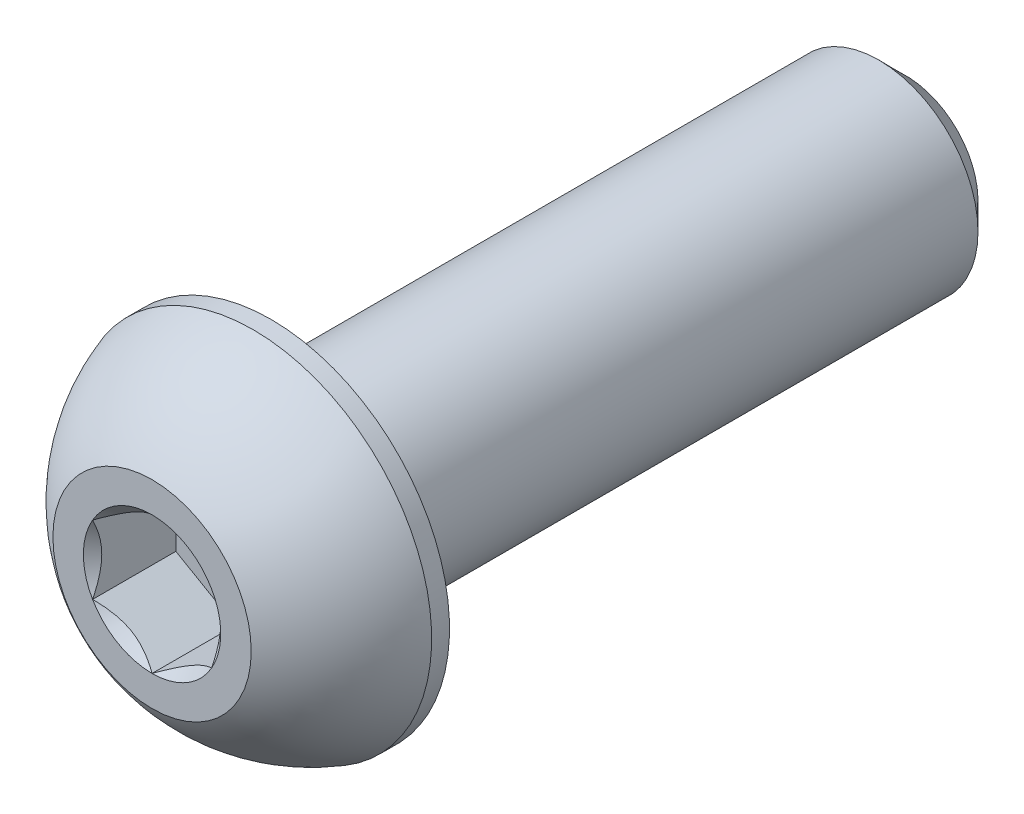
ISO-10303-21;
HEADER;
FILE_DESCRIPTION(('STEP AP214'),'2;1');
FILE_NAME('part.step','',(''),(''),'','','');
FILE_SCHEMA(('AUTOMOTIVE_DESIGN { 1 0 10303 214 1 1 1 1 }'));
ENDSEC;
DATA;
#1=APPLICATION_CONTEXT('core data for automotive mechanical design processes');
#2=APPLICATION_PROTOCOL_DEFINITION('international standard','automotive_design',2000,#1);
#3=PRODUCT_CONTEXT('',#1,'mechanical');
#4=PRODUCT('Part','Part','',(#3));
#5=PRODUCT_RELATED_PRODUCT_CATEGORY('part','',(#4));
#6=PRODUCT_DEFINITION_FORMATION('','',#4);
#7=PRODUCT_DEFINITION_CONTEXT('part definition',#1,'design');
#8=PRODUCT_DEFINITION('design','',#6,#7);
#9=PRODUCT_DEFINITION_SHAPE('','',#8);
#10=(LENGTH_UNIT() NAMED_UNIT(*) SI_UNIT(.MILLI.,.METRE.));
#11=(NAMED_UNIT(*) PLANE_ANGLE_UNIT() SI_UNIT($,.RADIAN.));
#12=(NAMED_UNIT(*) SI_UNIT($,.STERADIAN.) SOLID_ANGLE_UNIT());
#13=UNCERTAINTY_MEASURE_WITH_UNIT(LENGTH_MEASURE(1.E-05),#10,'distance_accuracy_value','');
#14=(GEOMETRIC_REPRESENTATION_CONTEXT(3) GLOBAL_UNCERTAINTY_ASSIGNED_CONTEXT((#13)) GLOBAL_UNIT_ASSIGNED_CONTEXT((#10,
#11,#12)) REPRESENTATION_CONTEXT('',''));
#15=CARTESIAN_POINT('',(0.,0.,0.));
#16=DIRECTION('',(0.,0.,1.));
#17=DIRECTION('',(1.,0.,0.));
#18=AXIS2_PLACEMENT_3D('',#15,#16,#17);
#19=CARTESIAN_POINT('',(0.,0.,-4.));
#20=DIRECTION('',(0.,0.,1.));
#21=DIRECTION('',(0.,-1.,0.));
#22=AXIS2_PLACEMENT_3D('',#19,#20,#21);
#23=PLANE('',#22);
#24=CARTESIAN_POINT('',(0.,0.,-4.));
#25=DIRECTION('',(0.,0.,1.));
#26=DIRECTION('',(0.,-1.,0.));
#27=AXIS2_PLACEMENT_3D('',#24,#25,#26);
#28=CIRCLE('',#27,0.912499999999998);
#29=CARTESIAN_POINT('',(0.,-0.912499999999999,-4.));
#30=VERTEX_POINT('',#29);
#31=EDGE_CURVE('E54',#30,#30,#28,.T.);
#32=ORIENTED_EDGE('',*,*,#31,.F.);
#33=EDGE_LOOP('',(#32));
#34=FACE_BOUND('',#33,.T.);
#35=ADVANCED_FACE('F41',(#34),#23,.F.);
#36=CARTESIAN_POINT('',(0.,0.,-4.));
#37=DIRECTION('',(0.,0.,1.));
#38=DIRECTION('',(0.,-1.,0.));
#39=AXIS2_PLACEMENT_3D('',#36,#37,#38);
#40=CONICAL_SURFACE('',#39,0.912499999999998,0.785398163397448);
#41=CARTESIAN_POINT('',(0.,0.,-3.6625));
#42=DIRECTION('',(0.,0.,1.));
#43=DIRECTION('',(0.,-1.,0.));
#44=AXIS2_PLACEMENT_3D('',#41,#42,#43);
#45=CIRCLE('',#44,1.25);
#46=CARTESIAN_POINT('',(0.,-1.25,-3.6625));
#47=VERTEX_POINT('',#46);
#48=EDGE_CURVE('E185',#47,#47,#45,.T.);
#49=ORIENTED_EDGE('',*,*,#48,.F.);
#50=EDGE_LOOP('',(#49));
#51=FACE_BOUND('',#50,.T.);
#52=ORIENTED_EDGE('',*,*,#31,.T.);
#53=EDGE_LOOP('',(#52));
#54=FACE_BOUND('',#53,.T.);
#55=ADVANCED_FACE('F190',(#51,#54),#40,.T.);
#56=CARTESIAN_POINT('',(0.,0.,5.5));
#57=DIRECTION('',(0.,0.,1.));
#58=DIRECTION('',(0.,-1.,0.));
#59=AXIS2_PLACEMENT_3D('',#56,#57,#58);
#60=CYLINDRICAL_SURFACE('',#59,1.25);
#61=CARTESIAN_POINT('',(0.,0.,4.));
#62=DIRECTION('',(0.,0.,1.));
#63=DIRECTION('',(0.,-1.,0.));
#64=AXIS2_PLACEMENT_3D('',#61,#62,#63);
#65=CIRCLE('',#64,1.25);
#66=CARTESIAN_POINT('',(0.,-1.25,4.));
#67=VERTEX_POINT('',#66);
#68=EDGE_CURVE('E182',#67,#67,#65,.T.);
#69=ORIENTED_EDGE('',*,*,#68,.F.);
#70=EDGE_LOOP('',(#69));
#71=FACE_BOUND('',#70,.T.);
#72=ORIENTED_EDGE('',*,*,#48,.T.);
#73=EDGE_LOOP('',(#72));
#74=FACE_BOUND('',#73,.T.);
#75=ADVANCED_FACE('F196',(#71,#74),#60,.T.);
#76=CARTESIAN_POINT('',(0.,-2.25,4.));
#77=DIRECTION('',(0.,0.,1.));
#78=DIRECTION('',(0.,-1.,0.));
#79=AXIS2_PLACEMENT_3D('',#76,#77,#78);
#80=PLANE('',#79);
#81=CARTESIAN_POINT('',(0.,0.,4.));
#82=DIRECTION('',(0.,0.,1.));
#83=DIRECTION('',(0.,-1.,0.));
#84=AXIS2_PLACEMENT_3D('',#81,#82,#83);
#85=CIRCLE('',#84,2.25);
#86=CARTESIAN_POINT('',(0.,-2.25,4.));
#87=VERTEX_POINT('',#86);
#88=EDGE_CURVE('E176',#87,#87,#85,.T.);
#89=ORIENTED_EDGE('',*,*,#88,.F.);
#90=EDGE_LOOP('',(#89));
#91=FACE_BOUND('',#90,.T.);
#92=ORIENTED_EDGE('',*,*,#68,.T.);
#93=EDGE_LOOP('',(#92));
#94=FACE_BOUND('',#93,.T.);
#95=ADVANCED_FACE('F201',(#91,#94),#80,.F.);
#96=CARTESIAN_POINT('',(0.,0.,3.48995098039216));
#97=DIRECTION('',(0.,0.,1.));
#98=DIRECTION('',(0.,-1.,0.));
#99=AXIS2_PLACEMENT_3D('',#96,#97,#98);
#100=SPHERICAL_SURFACE('',#99,2.36702282651149);
#101=CARTESIAN_POINT('',(0.,0.,5.5));
#102=DIRECTION('',(0.,0.,1.));
#103=DIRECTION('',(0.,-1.,0.));
#104=AXIS2_PLACEMENT_3D('',#101,#102,#103);
#105=CIRCLE('',#104,1.25);
#106=CARTESIAN_POINT('',(0.,-1.25,5.5));
#107=VERTEX_POINT('',#106);
#108=EDGE_CURVE('E179',#107,#107,#105,.T.);
#109=CARTESIAN_POINT('',(0.,0.,4.225));
#110=DIRECTION('',(0.,0.,1.));
#111=DIRECTION('',(0.,-1.,0.));
#112=AXIS2_PLACEMENT_3D('',#109,#110,#111);
#113=CIRCLE('',#112,2.25);
#114=CARTESIAN_POINT('',(0.,-2.25,4.225));
#115=VERTEX_POINT('',#114);
#116=EDGE_CURVE('E173',#115,#115,#113,.T.);
#117=CARTESIAN_POINT('',(0.,-1.25,5.5));
#118=CARTESIAN_POINT('',(0.,-1.26462917100962,5.49090251661049));
#119=CARTESIAN_POINT('',(0.,-1.27915898996254,5.48164527352318));
#120=CARTESIAN_POINT('',(0.,-1.30801307458842,5.46281579935833));
#121=CARTESIAN_POINT('',(0.,-1.32233734026139,5.45324356828078));
#122=CARTESIAN_POINT('',(0.,-1.35077346916084,5.43378864954077));
#123=CARTESIAN_POINT('',(0.,-1.36488533238733,5.4239059618783));
#124=CARTESIAN_POINT('',(0.,-1.39288993473665,5.40383484960455));
#125=CARTESIAN_POINT('',(0.,-1.40678267385948,5.39364642499327));
#126=CARTESIAN_POINT('',(0.,-1.43434240376681,5.37296869342376));
#127=CARTESIAN_POINT('',(0.,-1.44800939455129,5.36247938646554));
#128=CARTESIAN_POINT('',(0.,-1.47511111304782,5.34120489112507));
#129=CARTESIAN_POINT('',(0.,-1.48854584075986,5.33041970274282));
#130=CARTESIAN_POINT('',(0.,-1.51517662859343,5.30855858575153));
#131=CARTESIAN_POINT('',(0.,-1.52837268871496,5.29748265714249));
#132=CARTESIAN_POINT('',(0.,-1.55451985075898,5.27504533969981));
#133=CARTESIAN_POINT('',(0.,-1.56747095268147,5.26368395086616));
#134=CARTESIAN_POINT('',(0.,-1.59312202445558,5.24068112900137));
#135=CARTESIAN_POINT('',(0.,-1.60582199430721,5.22903969597022));
#136=CARTESIAN_POINT('',(0.,-1.6309647477936,5.2054823352511));
#137=CARTESIAN_POINT('',(0.,-1.64340753142836,5.19356640756313));
#138=CARTESIAN_POINT('',(0.,-1.66802998093452,5.16946573792022));
#139=CARTESIAN_POINT('',(0.,-1.68020964680593,5.15728099596527));
#140=CARTESIAN_POINT('',(0.,-1.70430005466935,5.13264850632462));
#141=CARTESIAN_POINT('',(0.,-1.71621079666137,5.12020075863892));
#142=CARTESIAN_POINT('',(0.,-1.73975767884732,5.095048191449));
#143=CARTESIAN_POINT('',(0.,-1.75139381904126,5.0823433719448));
#144=CARTESIAN_POINT('',(0.,-1.77438595061668,5.05668271757783));
#145=CARTESIAN_POINT('',(0.,-1.78574194199815,5.04372688271506));
#146=CARTESIAN_POINT('',(0.,-1.80816836248277,5.01757037375133));
#147=CARTESIAN_POINT('',(0.,-1.81923879158591,5.00436969965038));
#148=CARTESIAN_POINT('',(0.,-1.84108881017717,4.97772980504691));
#149=CARTESIAN_POINT('',(0.,-1.85186839966529,4.9642905845444));
#150=CARTESIAN_POINT('',(0.,-1.87313160033471,4.93718000369089));
#151=CARTESIAN_POINT('',(0.,-1.88361521151601,4.9235086433399));
#152=CARTESIAN_POINT('',(0.,-1.90428145797454,4.89594030000488));
#153=CARTESIAN_POINT('',(0.,-1.91446409325177,4.88204331702085));
#154=CARTESIAN_POINT('',(0.,-1.93452353378186,4.85403035319083));
#155=CARTESIAN_POINT('',(0.,-1.94440033903471,4.83991437234483));
#156=CARTESIAN_POINT('',(0.,-1.96384341118664,4.81147014195944));
#157=CARTESIAN_POINT('',(0.,-1.97340967808572,4.79714189242005));
#158=CARTESIAN_POINT('',(0.,-1.99222711323609,4.76827995500615));
#159=CARTESIAN_POINT('',(0.,-2.00147828148738,4.75374626713164));
#160=CARTESIAN_POINT('',(0.,-2.01966110925757,4.72448038133943));
#161=CARTESIAN_POINT('',(0.,-2.02859276877647,4.70974818342174));
#162=CARTESIAN_POINT('',(0.,-2.04613232130859,4.68009230046584));
#163=CARTESIAN_POINT('',(0.,-2.0547402143218,4.66516861542764));
#164=CARTESIAN_POINT('',(0.,-2.07162813041181,4.63513687243686));
#165=CARTESIAN_POINT('',(0.,-2.0799081534886,4.62002881448427));
#166=CARTESIAN_POINT('',(0.,-2.09613638256798,4.58963552776085));
#167=CARTESIAN_POINT('',(0.,-2.10408458857057,4.57435029899003));
#168=CARTESIAN_POINT('',(0.,-2.11964539455964,4.54360995719053));
#169=CARTESIAN_POINT('',(0.,-2.12725799454612,4.52815484416185));
#170=CARTESIAN_POINT('',(0.,-2.14214395948377,4.49708210136983));
#171=CARTESIAN_POINT('',(0.,-2.14941732443493,4.4814644716065));
#172=CARTESIAN_POINT('',(0.,-2.16362135223167,4.45007414042306));
#173=CARTESIAN_POINT('',(0.,-2.17055201507725,4.43430143900295));
#174=CARTESIAN_POINT('',(0.,-2.18406733408852,4.40260848320124));
#175=CARTESIAN_POINT('',(0.,-2.19065199025422,4.38668822881965));
#176=CARTESIAN_POINT('',(0.,-2.20347215952944,4.3547077572721));
#177=CARTESIAN_POINT('',(0.,-2.20970767263897,4.33864754010615));
#178=CARTESIAN_POINT('',(0.,-2.2218265737175,4.30639479562423));
#179=CARTESIAN_POINT('',(0.,-2.2277099616865,4.29020226830828));
#180=CARTESIAN_POINT('',(0.,-2.23912184359131,4.2576926351465));
#181=CARTESIAN_POINT('',(0.,-2.24465033752712,4.24137552930068));
#182=CARTESIAN_POINT('',(0.,-2.25,4.225));
#183=B_SPLINE_CURVE_WITH_KNOTS('',3,(#117,#118,#119,#120,#121,#122,#123,#124,#125,#126,#127,
#128,#129,#130,#131,#132,#133,#134,#135,#136,#137,#138,#139,#140,#141,#142,#143,#144,#145,#146,
#147,#148,#149,#150,#151,#152,#153,#154,#155,#156,#157,#158,#159,#160,#161,#162,#163,#164,#165,
#166,#167,#168,#169,#170,#171,#172,#173,#174,#175,#176,#177,#178,#179,#180,#181,#182),
.UNSPECIFIED.,.F.,.F.,(4,2,2,2,2,2,2,2,2,2,2,2,2,2,2,2,2,2,2,2,2,2,2,2,2,2,2,2,2,2,2,2,4),(0.,
0.0516806087027544,0.103361217405509,0.155041826108264,0.206722434811019,0.258403043513774,
0.310083652216528,0.361764260919282,0.413444869622037,0.465125478324792,0.516806087027546,
0.568486695730301,0.620167304433056,0.671847913135811,0.723528521838565,0.77520913054132,
0.826889739244075,0.878570347946829,0.930250956649584,0.981931565352339,1.03361217405509,
1.08529278275785,1.1369733914606,1.18865400016336,1.24033460886611,1.29201521756887,
1.34369582627162,1.39537643497438,1.44705704367713,1.49873765237989,1.55041826108264,
1.6020988697854,1.65377947848815),.UNSPECIFIED.);
#184=EDGE_CURVE('BSEAM206',#107,#115,#183,.T.);
#185=ORIENTED_EDGE('',*,*,#108,.F.);
#186=ORIENTED_EDGE('',*,*,#116,.T.);
#187=ORIENTED_EDGE('',*,*,#184,.T.);
#188=ORIENTED_EDGE('',*,*,#184,.F.);
#189=EDGE_LOOP('',(#185,#187,#186,#188));
#190=FACE_BOUND('',#189,.T.);
#191=ADVANCED_FACE('F206',(#190),#100,.T.);
#192=CARTESIAN_POINT('',(0.,-1.25,5.5));
#193=DIRECTION('',(0.,0.,-1.));
#194=DIRECTION('',(0.,1.,0.));
#195=AXIS2_PLACEMENT_3D('',#192,#193,#194);
#196=PLANE('',#195);
#197=CARTESIAN_POINT('',(0.,0.,5.5));
#198=DIRECTION('',(0.,0.,1.));
#199=DIRECTION('',(1.,0.,0.));
#200=AXIS2_PLACEMENT_3D('',#197,#198,#199);
#201=CIRCLE('',#200,0.866025403784438);
#202=CARTESIAN_POINT('',(0.,0.866025403784436,5.5));
#203=VERTEX_POINT('',#202);
#204=CARTESIAN_POINT('',(-0.75,0.433012701892217,5.5));
#205=VERTEX_POINT('',#204);
#206=EDGE_CURVE('E140',#203,#205,#201,.T.);
#207=ORIENTED_EDGE('',*,*,#206,.F.);
#208=CARTESIAN_POINT('',(0.75,0.433012701892218,5.5));
#209=VERTEX_POINT('',#208);
#210=EDGE_CURVE('E137',#209,#203,#201,.T.);
#211=ORIENTED_EDGE('',*,*,#210,.F.);
#212=CARTESIAN_POINT('',(0.75,-0.43301270189222,5.5));
#213=VERTEX_POINT('',#212);
#214=EDGE_CURVE('E107',#213,#209,#201,.T.);
#215=ORIENTED_EDGE('',*,*,#214,.F.);
#216=CARTESIAN_POINT('',(0.,-0.866025403784439,5.5));
#217=VERTEX_POINT('',#216);
#218=EDGE_CURVE('E99',#217,#213,#201,.T.);
#219=ORIENTED_EDGE('',*,*,#218,.F.);
#220=CARTESIAN_POINT('',(-0.749999999999999,-0.43301270189222,5.5));
#221=VERTEX_POINT('',#220);
#222=EDGE_CURVE('E60',#221,#217,#201,.T.);
#223=ORIENTED_EDGE('',*,*,#222,.F.);
#224=EDGE_CURVE('E67',#205,#221,#201,.T.);
#225=ORIENTED_EDGE('',*,*,#224,.F.);
#226=EDGE_LOOP('',(#207,#211,#215,#219,#223,#225));
#227=FACE_BOUND('',#226,.T.);
#228=ORIENTED_EDGE('',*,*,#108,.T.);
#229=EDGE_LOOP('',(#228));
#230=FACE_BOUND('',#229,.T.);
#231=ADVANCED_FACE('F134',(#227,#230),#196,.F.);
#232=CARTESIAN_POINT('',(0.,0.,5.5));
#233=DIRECTION('',(0.,0.,1.));
#234=DIRECTION('',(0.,-1.,0.));
#235=AXIS2_PLACEMENT_3D('',#232,#233,#234);
#236=CYLINDRICAL_SURFACE('',#235,2.25);
#237=ORIENTED_EDGE('',*,*,#116,.F.);
#238=EDGE_LOOP('',(#237));
#239=FACE_BOUND('',#238,.T.);
#240=ORIENTED_EDGE('',*,*,#88,.T.);
#241=EDGE_LOOP('',(#240));
#242=FACE_BOUND('',#241,.T.);
#243=ADVANCED_FACE('F212',(#239,#242),#236,.T.);
#244=CARTESIAN_POINT('',(0.,0.,5.5));
#245=DIRECTION('',(0.,0.,1.));
#246=DIRECTION('',(1.,0.,0.));
#247=AXIS2_PLACEMENT_3D('',#244,#245,#246);
#248=CONICAL_SURFACE('',#247,0.866025403784438,0.78539816339745);
#249=ORIENTED_EDGE('',*,*,#214,.T.);
#250=CARTESIAN_POINT('',(0.75,-0.863604064848464,5.7777892581354));
#251=CARTESIAN_POINT('',(0.75,-0.842575879734334,5.76191493200841));
#252=CARTESIAN_POINT('',(0.75,-0.821430496291562,5.746196265183));
#253=CARTESIAN_POINT('',(0.75,-0.77885785741902,5.71513452062663));
#254=CARTESIAN_POINT('',(0.75,-0.757430533042238,5.69979153749355));
#255=CARTESIAN_POINT('',(0.75,-0.692340710712937,5.65420358029367));
#256=CARTESIAN_POINT('',(0.75,-0.648190081053414,5.62464409174343));
#257=CARTESIAN_POINT('',(0.75,-0.555607181501751,5.5666155826928));
#258=CARTESIAN_POINT('',(0.75,-0.507074363017997,5.53830510936579));
#259=CARTESIAN_POINT('',(0.75,-0.407587529772338,5.48651811176889));
#260=CARTESIAN_POINT('',(0.75,-0.356642419548471,5.46302529153185));
#261=CARTESIAN_POINT('',(0.75,-0.280165468820771,5.43428689950068));
#262=CARTESIAN_POINT('',(0.75,-0.255770023930572,5.42603927481306));
#263=CARTESIAN_POINT('',(0.75,-0.206403277885132,5.41149717542019));
#264=CARTESIAN_POINT('',(0.75,-0.181431937185907,5.40520283526912));
#265=CARTESIAN_POINT('',(0.75,-0.106699879404925,5.3899931738806));
#266=CARTESIAN_POINT('',(0.75,-0.056190717176218,5.38437718471289));
#267=CARTESIAN_POINT('',(0.75,0.0430767231749056,5.38362825645435));
#268=CARTESIAN_POINT('',(0.75,0.0918322434166278,5.38812345140561));
#269=CARTESIAN_POINT('',(0.75,0.164112195698294,5.40133730744598));
#270=CARTESIAN_POINT('',(0.75,0.188278676879436,5.40690144638208));
#271=CARTESIAN_POINT('',(0.75,0.23609448012033,5.41992316614872));
#272=CARTESIAN_POINT('',(0.75,0.25974384527304,5.42738058854766));
#273=CARTESIAN_POINT('',(0.75,0.334198278463818,5.45366646946609));
#274=CARTESIAN_POINT('',(0.75,0.383940060445494,5.47549033804844));
#275=CARTESIAN_POINT('',(0.75,0.481089225076665,5.52401180410059));
#276=CARTESIAN_POINT('',(0.75,0.528487417973016,5.55072691131035));
#277=CARTESIAN_POINT('',(0.75,0.619071540465249,5.60584285115078));
#278=CARTESIAN_POINT('',(0.75,0.662349745300237,5.63409394545219));
#279=CARTESIAN_POINT('',(0.75,0.726111623216222,5.6777671470975));
#280=CARTESIAN_POINT('',(0.75,0.747090419255278,5.6924788605167));
#281=CARTESIAN_POINT('',(0.75,0.788761341501858,5.7222913841024));
#282=CARTESIAN_POINT('',(0.75,0.809453544535618,5.73739208676303));
#283=CARTESIAN_POINT('',(0.75,0.830026390097467,5.75265408930473));
#284=B_SPLINE_CURVE_WITH_KNOTS('',3,(#250,#251,#252,#253,#254,#255,#256,#257,#258,#259,#260,
#261,#262,#263,#264,#265,#266,#267,#268,#269,#270,#271,#272,#273,#274,#275,#276,#277,#278,#279,
#280,#281,#282,#283),.UNSPECIFIED.,.F.,.F.,(4,2,2,2,2,2,2,2,2,2,2,2,2,2,2,2,4),(0.,
0.0790398443124678,0.158099390497593,0.317425208674102,0.485845155681378,0.653685658303958,
0.730869805636066,0.80805926870401,0.959469653380781,1.10540290447489,1.17973203111653,
1.25405493988072,1.41653726506054,1.57961304287543,1.73458511695816,1.81145152932466,
1.8882969211581),.UNSPECIFIED.);
#285=EDGE_CURVE('E11',#213,#209,#284,.T.);
#286=ORIENTED_EDGE('',*,*,#285,.F.);
#287=EDGE_LOOP('',(#249,#286));
#288=FACE_BOUND('',#287,.T.);
#289=ADVANCED_FACE('F111',(#288),#248,.F.);
#290=ORIENTED_EDGE('',*,*,#210,.T.);
#291=CARTESIAN_POINT('',(0.7502,0.43289723183838,5.50011549314477));
#292=CARTESIAN_POINT('',(0.724410037442318,0.447787073663447,5.48523411046392));
#293=CARTESIAN_POINT('',(0.69818879787134,0.462925913388237,5.47122626560696));
#294=CARTESIAN_POINT('',(0.644720291764293,0.493795969782308,5.44557752468226));
#295=CARTESIAN_POINT('',(0.617467932539427,0.509530126716837,5.43395091170567));
#296=CARTESIAN_POINT('',(0.562514649618646,0.541257419404003,5.41403404577224));
#297=CARTESIAN_POINT('',(0.53482774330449,0.557242462217509,5.40569369408137));
#298=CARTESIAN_POINT('',(0.478844404869146,0.589564457733289,5.39284274196142));
#299=CARTESIAN_POINT('',(0.450549685156354,0.605900421776114,5.38832254058884));
#300=CARTESIAN_POINT('',(0.401789710731156,0.634052006136182,5.38424583309743));
#301=CARTESIAN_POINT('',(0.381387934344427,0.645830977225006,5.38364279661408));
#302=CARTESIAN_POINT('',(0.340623865303639,0.66936612345897,5.38465450601553));
#303=CARTESIAN_POINT('',(0.320261582348544,0.681122293004409,5.38626974099003));
#304=CARTESIAN_POINT('',(0.259465456913176,0.716222952390205,5.39433614697304));
#305=CARTESIAN_POINT('',(0.219334145003901,0.739392776123958,5.40400893582772));
#306=CARTESIAN_POINT('',(0.148889599645974,0.780063953349298,5.42735631797231));
#307=CARTESIAN_POINT('',(0.118246427990913,0.797755796753171,5.43980855807225));
#308=CARTESIAN_POINT('',(0.05816065419521,0.832446334428587,5.46785961023086));
#309=CARTESIAN_POINT('',(0.0287145116184091,0.8494470727719,5.48344818590375));
#310=CARTESIAN_POINT('',(-0.000200000000000152,0.866140873838275,5.50011549314477));
#311=B_SPLINE_CURVE_WITH_KNOTS('',3,(#291,#292,#293,#294,#295,#296,#297,#298,#299,#300,#301,
#302,#303,#304,#305,#306,#307,#308,#309,#310),.UNSPECIFIED.,.F.,.F.,(4,2,2,2,2,2,2,2,2,4),(0.,
0.0999419466095595,0.200466857654446,0.299393763705717,0.39807129730023,0.468665775681748,
0.539275821398839,0.680536257244566,0.792918418368073,0.904939568716032),.UNSPECIFIED.);
#312=EDGE_CURVE('E139',#209,#203,#311,.T.);
#313=ORIENTED_EDGE('',*,*,#312,.F.);
#314=EDGE_LOOP('',(#290,#313));
#315=FACE_BOUND('',#314,.T.);
#316=ADVANCED_FACE('F291',(#315),#248,.F.);
#317=ORIENTED_EDGE('',*,*,#206,.T.);
#318=CARTESIAN_POINT('',(0.000200000000000006,0.866140873838274,5.50011549314477));
#319=CARTESIAN_POINT('',(-0.0255899625576814,0.851251032013207,5.48523411046392));
#320=CARTESIAN_POINT('',(-0.051811202128659,0.836112192288417,5.47122626560696));
#321=CARTESIAN_POINT('',(-0.105279708235706,0.805242135894346,5.44557752468226));
#322=CARTESIAN_POINT('',(-0.132532067460573,0.789507978959817,5.43395091170567));
#323=CARTESIAN_POINT('',(-0.187485350381353,0.757780686272651,5.41403404577224));
#324=CARTESIAN_POINT('',(-0.215172256695509,0.741795643459145,5.40569369408137));
#325=CARTESIAN_POINT('',(-0.271155595130853,0.709473647943365,5.39284274196142));
#326=CARTESIAN_POINT('',(-0.299450314843645,0.69313768390054,5.38832254058884));
#327=CARTESIAN_POINT('',(-0.348210289268843,0.664986099540472,5.38424583309743));
#328=CARTESIAN_POINT('',(-0.368612065655572,0.653207128451648,5.38364279661408));
#329=CARTESIAN_POINT('',(-0.40937613469636,0.629671982217685,5.38465450601553));
#330=CARTESIAN_POINT('',(-0.429738417651455,0.617915812672245,5.38626974099003));
#331=CARTESIAN_POINT('',(-0.490534543086824,0.582815153286449,5.39433614697304));
#332=CARTESIAN_POINT('',(-0.530665854996099,0.559645329552696,5.40400893582772));
#333=CARTESIAN_POINT('',(-0.601110400354025,0.518974152327356,5.42735631797231));
#334=CARTESIAN_POINT('',(-0.631753572009086,0.501282308923483,5.43980855807225));
#335=CARTESIAN_POINT('',(-0.691839345804789,0.466591771248067,5.46785961023086));
#336=CARTESIAN_POINT('',(-0.72128548838159,0.449591032904755,5.48344818590375));
#337=CARTESIAN_POINT('',(-0.750199999999999,0.43289723183838,5.50011549314477));
#338=B_SPLINE_CURVE_WITH_KNOTS('',3,(#318,#319,#320,#321,#322,#323,#324,#325,#326,#327,#328,
#329,#330,#331,#332,#333,#334,#335,#336,#337),.UNSPECIFIED.,.F.,.F.,(4,2,2,2,2,2,2,2,2,4),(0.,
0.0999419466095594,0.200466857654446,0.299393763705717,0.39807129730023,0.468665775681748,
0.539275821398839,0.680536257244566,0.792918418368073,0.904939568716031),.UNSPECIFIED.);
#339=EDGE_CURVE('E143',#203,#205,#338,.T.);
#340=ORIENTED_EDGE('',*,*,#339,.F.);
#341=EDGE_LOOP('',(#317,#340));
#342=FACE_BOUND('',#341,.T.);
#343=ADVANCED_FACE('F146',(#342),#248,.F.);
#344=ORIENTED_EDGE('',*,*,#224,.T.);
#345=CARTESIAN_POINT('',(-0.749999999999999,-0.863604064848464,5.7777892581354));
#346=CARTESIAN_POINT('',(-0.749999999999999,-0.842575879734334,5.76191493200841));
#347=CARTESIAN_POINT('',(-0.749999999999999,-0.821430496291562,5.746196265183));
#348=CARTESIAN_POINT('',(-0.749999999999999,-0.778857857419021,5.71513452062663));
#349=CARTESIAN_POINT('',(-0.749999999999999,-0.757430533042238,5.69979153749355));
#350=CARTESIAN_POINT('',(-0.749999999999999,-0.692340710712937,5.65420358029367));
#351=CARTESIAN_POINT('',(-0.749999999999999,-0.648190081053415,5.62464409174343));
#352=CARTESIAN_POINT('',(-0.749999999999999,-0.555607181501751,5.5666155826928));
#353=CARTESIAN_POINT('',(-0.749999999999999,-0.507074363017998,5.53830510936579));
#354=CARTESIAN_POINT('',(-0.749999999999999,-0.407587529772338,5.48651811176889));
#355=CARTESIAN_POINT('',(-0.749999999999999,-0.356642419548472,5.46302529153185));
#356=CARTESIAN_POINT('',(-0.749999999999999,-0.280165468820772,5.43428689950068));
#357=CARTESIAN_POINT('',(-0.749999999999999,-0.255770023930573,5.42603927481306));
#358=CARTESIAN_POINT('',(-0.749999999999999,-0.206403277885132,5.41149717542019));
#359=CARTESIAN_POINT('',(-0.749999999999999,-0.181431937185908,5.40520283526912));
#360=CARTESIAN_POINT('',(-0.749999999999999,-0.106699879404926,5.3899931738806));
#361=CARTESIAN_POINT('',(-0.749999999999999,-0.0561907171762186,5.38437718471289));
#362=CARTESIAN_POINT('',(-0.749999999999999,0.043076723174905,5.38362825645435));
#363=CARTESIAN_POINT('',(-0.749999999999999,0.0918322434166273,5.38812345140561));
#364=CARTESIAN_POINT('',(-0.749999999999999,0.164112195698293,5.40133730744598));
#365=CARTESIAN_POINT('',(-0.749999999999999,0.188278676879435,5.40690144638208));
#366=CARTESIAN_POINT('',(-0.749999999999999,0.23609448012033,5.41992316614872));
#367=CARTESIAN_POINT('',(-0.749999999999999,0.25974384527304,5.42738058854766));
#368=CARTESIAN_POINT('',(-0.749999999999999,0.334198278463818,5.45366646946609));
#369=CARTESIAN_POINT('',(-0.749999999999999,0.383940060445493,5.47549033804844));
#370=CARTESIAN_POINT('',(-0.749999999999999,0.481089225076664,5.52401180410059));
#371=CARTESIAN_POINT('',(-0.749999999999999,0.528487417973015,5.55072691131035));
#372=CARTESIAN_POINT('',(-0.749999999999999,0.619071540465249,5.60584285115078));
#373=CARTESIAN_POINT('',(-0.749999999999999,0.662349745300237,5.63409394545219));
#374=CARTESIAN_POINT('',(-0.749999999999999,0.726111623216223,5.6777671470975));
#375=CARTESIAN_POINT('',(-0.749999999999999,0.747090419255278,5.6924788605167));
#376=CARTESIAN_POINT('',(-0.749999999999999,0.788761341501858,5.7222913841024));
#377=CARTESIAN_POINT('',(-0.749999999999999,0.809453544535617,5.73739208676303));
#378=CARTESIAN_POINT('',(-0.749999999999999,0.830026390097467,5.75265408930473));
#379=B_SPLINE_CURVE_WITH_KNOTS('',3,(#345,#346,#347,#348,#349,#350,#351,#352,#353,#354,#355,
#356,#357,#358,#359,#360,#361,#362,#363,#364,#365,#366,#367,#368,#369,#370,#371,#372,#373,#374,
#375,#376,#377,#378),.UNSPECIFIED.,.F.,.F.,(4,2,2,2,2,2,2,2,2,2,2,2,2,2,2,2,4),(0.,
0.0790398443124677,0.158099390497594,0.317425208674102,0.485845155681378,0.653685658303958,
0.730869805636066,0.808059268704009,0.959469653380781,1.10540290447489,1.17973203111653,
1.25405493988072,1.41653726506054,1.57961304287543,1.73458511695816,1.81145152932467,
1.8882969211581),.UNSPECIFIED.);
#380=EDGE_CURVE('E149',#205,#221,#379,.F.);
#381=ORIENTED_EDGE('',*,*,#380,.F.);
#382=EDGE_LOOP('',(#344,#381));
#383=FACE_BOUND('',#382,.T.);
#384=ADVANCED_FACE('F150',(#383),#248,.F.);
#385=ORIENTED_EDGE('',*,*,#222,.T.);
#386=CARTESIAN_POINT('',(-0.750199999999999,-0.432897231838383,5.50011549314477));
#387=CARTESIAN_POINT('',(-0.724410037442318,-0.44778707366345,5.48523411046392));
#388=CARTESIAN_POINT('',(-0.69818879787134,-0.46292591338824,5.47122626560696));
#389=CARTESIAN_POINT('',(-0.644720291764294,-0.493795969782311,5.44557752468226));
#390=CARTESIAN_POINT('',(-0.617467932539427,-0.50953012671684,5.43395091170567));
#391=CARTESIAN_POINT('',(-0.562514649618647,-0.541257419404006,5.41403404577224));
#392=CARTESIAN_POINT('',(-0.534827743304491,-0.557242462217512,5.40569369408137));
#393=CARTESIAN_POINT('',(-0.478844404869147,-0.589564457733291,5.39284274196143));
#394=CARTESIAN_POINT('',(-0.450549685156355,-0.605900421776117,5.38832254058884));
#395=CARTESIAN_POINT('',(-0.401789710731157,-0.634052006136184,5.38424583309744));
#396=CARTESIAN_POINT('',(-0.381387934344428,-0.645830977225009,5.38364279661408));
#397=CARTESIAN_POINT('',(-0.34062386530364,-0.669366123458972,5.38465450601553));
#398=CARTESIAN_POINT('',(-0.320261582348545,-0.681122293004412,5.38626974099004));
#399=CARTESIAN_POINT('',(-0.259465456913177,-0.716222952390208,5.39433614697304));
#400=CARTESIAN_POINT('',(-0.219334145003901,-0.739392776123961,5.40400893582772));
#401=CARTESIAN_POINT('',(-0.148889599645975,-0.780063953349301,5.42735631797231));
#402=CARTESIAN_POINT('',(-0.118246427990914,-0.797755796753174,5.43980855807225));
#403=CARTESIAN_POINT('',(-0.0581606541952105,-0.83244633442859,5.46785961023086));
#404=CARTESIAN_POINT('',(-0.0287145116184095,-0.849447072771902,5.48344818590375));
#405=CARTESIAN_POINT('',(0.000199999999999996,-0.866140873838278,5.50011549314477));
#406=B_SPLINE_CURVE_WITH_KNOTS('',3,(#386,#387,#388,#389,#390,#391,#392,#393,#394,#395,#396,
#397,#398,#399,#400,#401,#402,#403,#404,#405),.UNSPECIFIED.,.F.,.F.,(4,2,2,2,2,2,2,2,2,4),(0.,
0.0999419466095591,0.200466857654445,0.299393763705716,0.398071297300229,0.468665775681746,
0.539275821398838,0.680536257244565,0.792918418368073,0.904939568716031),.UNSPECIFIED.);
#407=EDGE_CURVE('E123',#221,#217,#406,.T.);
#408=ORIENTED_EDGE('',*,*,#407,.F.);
#409=EDGE_LOOP('',(#385,#408));
#410=FACE_BOUND('',#409,.T.);
#411=ADVANCED_FACE('F240',(#410),#248,.F.);
#412=ORIENTED_EDGE('',*,*,#218,.T.);
#413=CARTESIAN_POINT('',(-0.00020000000000007,-0.866140873838278,5.50011549314477));
#414=CARTESIAN_POINT('',(0.0255899625576814,-0.85125103201321,5.48523411046392));
#415=CARTESIAN_POINT('',(0.051811202128659,-0.83611219228842,5.47122626560696));
#416=CARTESIAN_POINT('',(0.105279708235706,-0.805242135894349,5.44557752468226));
#417=CARTESIAN_POINT('',(0.132532067460572,-0.78950797895982,5.43395091170567));
#418=CARTESIAN_POINT('',(0.187485350381353,-0.757780686272654,5.41403404577224));
#419=CARTESIAN_POINT('',(0.215172256695509,-0.741795643459148,5.40569369408137));
#420=CARTESIAN_POINT('',(0.271155595130852,-0.709473647943369,5.39284274196143));
#421=CARTESIAN_POINT('',(0.299450314843644,-0.693137683900543,5.38832254058884));
#422=CARTESIAN_POINT('',(0.348210289268842,-0.664986099540476,5.38424583309744));
#423=CARTESIAN_POINT('',(0.368612065655572,-0.653207128451651,5.38364279661408));
#424=CARTESIAN_POINT('',(0.409376134696359,-0.629671982217688,5.38465450601553));
#425=CARTESIAN_POINT('',(0.429738417651454,-0.617915812672249,5.38626974099003));
#426=CARTESIAN_POINT('',(0.490534543086823,-0.582815153286452,5.39433614697304));
#427=CARTESIAN_POINT('',(0.530665854996098,-0.5596453295527,5.40400893582772));
#428=CARTESIAN_POINT('',(0.601110400354025,-0.51897415232736,5.42735631797231));
#429=CARTESIAN_POINT('',(0.631753572009086,-0.501282308923486,5.43980855807225));
#430=CARTESIAN_POINT('',(0.691839345804789,-0.46659177124807,5.46785961023086));
#431=CARTESIAN_POINT('',(0.72128548838159,-0.449591032904758,5.48344818590375));
#432=CARTESIAN_POINT('',(0.7502,-0.432897231838383,5.50011549314477));
#433=B_SPLINE_CURVE_WITH_KNOTS('',3,(#413,#414,#415,#416,#417,#418,#419,#420,#421,#422,#423,
#424,#425,#426,#427,#428,#429,#430,#431,#432),.UNSPECIFIED.,.F.,.F.,(4,2,2,2,2,2,2,2,2,4),(0.,
0.0999419466095594,0.200466857654446,0.299393763705717,0.398071297300229,0.468665775681747,
0.539275821398838,0.680536257244565,0.792918418368073,0.904939568716031),.UNSPECIFIED.);
#434=EDGE_CURVE('E103',#217,#213,#433,.T.);
#435=ORIENTED_EDGE('',*,*,#434,.F.);
#436=EDGE_LOOP('',(#412,#435));
#437=FACE_BOUND('',#436,.T.);
#438=ADVANCED_FACE('F101',(#437),#248,.F.);
#439=CARTESIAN_POINT('',(0.75,-0.433012701892221,4.45));
#440=DIRECTION('',(0.,0.,1.));
#441=DIRECTION('',(1.,0.,0.));
#442=AXIS2_PLACEMENT_3D('',#439,#440,#441);
#443=PLANE('',#442);
#444=DIRECTION('',(0.866025403784439,0.5,0.));
#445=VECTOR('',#444,1.);
#446=CARTESIAN_POINT('',(0.,-0.86602540378444,4.45));
#447=LINE('',#446,#445);
#448=CARTESIAN_POINT('',(0.,-0.86602540378444,4.45));
#449=VERTEX_POINT('',#448);
#450=CARTESIAN_POINT('',(0.75,-0.433012701892221,4.45));
#451=VERTEX_POINT('',#450);
#452=EDGE_CURVE('E122',#449,#451,#447,.T.);
#453=ORIENTED_EDGE('',*,*,#452,.T.);
#454=DIRECTION('',(0.,1.,0.));
#455=VECTOR('',#454,1.);
#456=CARTESIAN_POINT('',(0.75,-0.433012701892221,4.45));
#457=LINE('',#456,#455);
#458=CARTESIAN_POINT('',(0.75,0.433012701892218,4.45));
#459=VERTEX_POINT('',#458);
#460=EDGE_CURVE('E127',#451,#459,#457,.T.);
#461=ORIENTED_EDGE('',*,*,#460,.T.);
#462=DIRECTION('',(-0.866025403784439,0.5,0.));
#463=VECTOR('',#462,1.);
#464=CARTESIAN_POINT('',(0.75,0.433012701892218,4.45));
#465=LINE('',#464,#463);
#466=CARTESIAN_POINT('',(0.,0.866025403784436,4.45));
#467=VERTEX_POINT('',#466);
#468=EDGE_CURVE('E274',#459,#467,#465,.T.);
#469=ORIENTED_EDGE('',*,*,#468,.T.);
#470=DIRECTION('',(-0.866025403784439,-0.5,0.));
#471=VECTOR('',#470,1.);
#472=CARTESIAN_POINT('',(0.,0.866025403784436,4.45));
#473=LINE('',#472,#471);
#474=CARTESIAN_POINT('',(-0.749999999999999,0.433012701892218,4.45));
#475=VERTEX_POINT('',#474);
#476=EDGE_CURVE('E276',#467,#475,#473,.T.);
#477=ORIENTED_EDGE('',*,*,#476,.T.);
#478=DIRECTION('',(0.,-1.,0.));
#479=VECTOR('',#478,1.);
#480=CARTESIAN_POINT('',(-0.749999999999999,0.433012701892218,4.45));
#481=LINE('',#480,#479);
#482=CARTESIAN_POINT('',(-0.749999999999999,-0.433012701892221,4.45));
#483=VERTEX_POINT('',#482);
#484=EDGE_CURVE('E164',#475,#483,#481,.T.);
#485=ORIENTED_EDGE('',*,*,#484,.T.);
#486=DIRECTION('',(0.866025403784439,-0.5,0.));
#487=VECTOR('',#486,1.);
#488=CARTESIAN_POINT('',(-0.749999999999999,-0.433012701892221,4.45));
#489=LINE('',#488,#487);
#490=EDGE_CURVE('E130',#483,#449,#489,.T.);
#491=ORIENTED_EDGE('',*,*,#490,.T.);
#492=EDGE_LOOP('',(#453,#461,#469,#477,#485,#491));
#493=FACE_BOUND('',#492,.T.);
#494=ADVANCED_FACE('F239',(#493),#443,.T.);
#495=CARTESIAN_POINT('',(0.75,-0.433012701892221,4.45));
#496=DIRECTION('',(1.,0.,0.));
#497=DIRECTION('',(0.,0.,-1.));
#498=AXIS2_PLACEMENT_3D('',#495,#496,#497);
#499=PLANE('',#498);
#500=DIRECTION('',(0.,0.,1.));
#501=VECTOR('',#500,1.);
#502=CARTESIAN_POINT('',(0.75,-0.433012701892221,4.45));
#503=LINE('',#502,#501);
#504=EDGE_CURVE('E119',#451,#213,#503,.T.);
#505=ORIENTED_EDGE('',*,*,#504,.T.);
#506=ORIENTED_EDGE('',*,*,#285,.T.);
#507=DIRECTION('',(0.,0.,1.));
#508=VECTOR('',#507,1.);
#509=CARTESIAN_POINT('',(0.75,0.433012701892218,4.45));
#510=LINE('',#509,#508);
#511=EDGE_CURVE('E129',#459,#209,#510,.T.);
#512=ORIENTED_EDGE('',*,*,#511,.F.);
#513=ORIENTED_EDGE('',*,*,#460,.F.);
#514=EDGE_LOOP('',(#505,#506,#512,#513));
#515=FACE_BOUND('',#514,.T.);
#516=ADVANCED_FACE('F125',(#515),#499,.F.);
#517=CARTESIAN_POINT('',(0.75,0.433012701892218,4.45));
#518=DIRECTION('',(0.5,0.866025403784439,0.));
#519=DIRECTION('',(-0.866025403784439,0.5,0.));
#520=AXIS2_PLACEMENT_3D('',#517,#518,#519);
#521=PLANE('',#520);
#522=ORIENTED_EDGE('',*,*,#511,.T.);
#523=ORIENTED_EDGE('',*,*,#312,.T.);
#524=DIRECTION('',(0.,0.,1.));
#525=VECTOR('',#524,1.);
#526=CARTESIAN_POINT('',(0.,0.866025403784436,4.45));
#527=LINE('',#526,#525);
#528=EDGE_CURVE('E160',#467,#203,#527,.T.);
#529=ORIENTED_EDGE('',*,*,#528,.F.);
#530=ORIENTED_EDGE('',*,*,#468,.F.);
#531=EDGE_LOOP('',(#522,#523,#529,#530));
#532=FACE_BOUND('',#531,.T.);
#533=ADVANCED_FACE('F265',(#532),#521,.F.);
#534=CARTESIAN_POINT('',(0.,0.866025403784436,4.45));
#535=DIRECTION('',(-0.5,0.866025403784439,0.));
#536=DIRECTION('',(-0.866025403784439,-0.5,0.));
#537=AXIS2_PLACEMENT_3D('',#534,#535,#536);
#538=PLANE('',#537);
#539=ORIENTED_EDGE('',*,*,#528,.T.);
#540=ORIENTED_EDGE('',*,*,#339,.T.);
#541=DIRECTION('',(0.,0.,1.));
#542=VECTOR('',#541,1.);
#543=CARTESIAN_POINT('',(-0.749999999999999,0.433012701892218,4.45));
#544=LINE('',#543,#542);
#545=EDGE_CURVE('E158',#475,#205,#544,.T.);
#546=ORIENTED_EDGE('',*,*,#545,.F.);
#547=ORIENTED_EDGE('',*,*,#476,.F.);
#548=EDGE_LOOP('',(#539,#540,#546,#547));
#549=FACE_BOUND('',#548,.T.);
#550=ADVANCED_FACE('F156',(#549),#538,.F.);
#551=CARTESIAN_POINT('',(-0.749999999999999,0.433012701892218,4.45));
#552=DIRECTION('',(-1.,0.,0.));
#553=DIRECTION('',(0.,-1.,0.));
#554=AXIS2_PLACEMENT_3D('',#551,#552,#553);
#555=PLANE('',#554);
#556=ORIENTED_EDGE('',*,*,#545,.T.);
#557=ORIENTED_EDGE('',*,*,#380,.T.);
#558=DIRECTION('',(0.,0.,1.));
#559=VECTOR('',#558,1.);
#560=CARTESIAN_POINT('',(-0.749999999999999,-0.433012701892221,4.45));
#561=LINE('',#560,#559);
#562=EDGE_CURVE('E166',#483,#221,#561,.T.);
#563=ORIENTED_EDGE('',*,*,#562,.F.);
#564=ORIENTED_EDGE('',*,*,#484,.F.);
#565=EDGE_LOOP('',(#556,#557,#563,#564));
#566=FACE_BOUND('',#565,.T.);
#567=ADVANCED_FACE('F162',(#566),#555,.F.);
#568=CARTESIAN_POINT('',(-0.749999999999999,-0.433012701892221,4.45));
#569=DIRECTION('',(-0.5,-0.866025403784439,0.));
#570=DIRECTION('',(0.866025403784439,-0.5,0.));
#571=AXIS2_PLACEMENT_3D('',#568,#569,#570);
#572=PLANE('',#571);
#573=ORIENTED_EDGE('',*,*,#562,.T.);
#574=ORIENTED_EDGE('',*,*,#407,.T.);
#575=DIRECTION('',(0.,0.,1.));
#576=VECTOR('',#575,1.);
#577=CARTESIAN_POINT('',(0.,-0.86602540378444,4.45));
#578=LINE('',#577,#576);
#579=EDGE_CURVE('E121',#449,#217,#578,.T.);
#580=ORIENTED_EDGE('',*,*,#579,.F.);
#581=ORIENTED_EDGE('',*,*,#490,.F.);
#582=EDGE_LOOP('',(#573,#574,#580,#581));
#583=FACE_BOUND('',#582,.T.);
#584=ADVANCED_FACE('F221',(#583),#572,.F.);
#585=CARTESIAN_POINT('',(0.,-0.86602540378444,4.45));
#586=DIRECTION('',(0.5,-0.866025403784439,0.));
#587=DIRECTION('',(0.866025403784439,0.5,0.));
#588=AXIS2_PLACEMENT_3D('',#585,#586,#587);
#589=PLANE('',#588);
#590=ORIENTED_EDGE('',*,*,#579,.T.);
#591=ORIENTED_EDGE('',*,*,#434,.T.);
#592=ORIENTED_EDGE('',*,*,#504,.F.);
#593=ORIENTED_EDGE('',*,*,#452,.F.);
#594=EDGE_LOOP('',(#590,#591,#592,#593));
#595=FACE_BOUND('',#594,.T.);
#596=ADVANCED_FACE('F117',(#595),#589,.F.);
#597=CLOSED_SHELL('',(#35,#55,#75,#95,#191,#231,#243,#289,#316,#343,#384,#411,#438,#494,#516,
#533,#550,#567,#584,#596));
#598=MANIFOLD_SOLID_BREP('B2',#597);
#599=ADVANCED_BREP_SHAPE_REPRESENTATION('',(#18,#598),#14);
#600=SHAPE_DEFINITION_REPRESENTATION(#9,#599);
ENDSEC;
END-ISO-10303-21;
